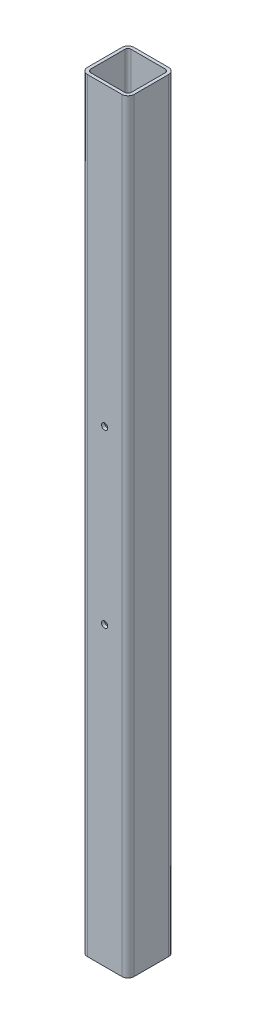
ISO-10303-21;
HEADER;
FILE_DESCRIPTION(('STEP AP214'),'2;1');
FILE_NAME('part.step','',(''),(''),'','','');
FILE_SCHEMA(('AUTOMOTIVE_DESIGN { 1 0 10303 214 1 1 1 1 }'));
ENDSEC;
DATA;
#1=APPLICATION_CONTEXT('core data for automotive mechanical design processes');
#2=APPLICATION_PROTOCOL_DEFINITION('international standard','automotive_design',2000,#1);
#3=PRODUCT_CONTEXT('',#1,'mechanical');
#4=PRODUCT('Part','Part','',(#3));
#5=PRODUCT_RELATED_PRODUCT_CATEGORY('part','',(#4));
#6=PRODUCT_DEFINITION_FORMATION('','',#4);
#7=PRODUCT_DEFINITION_CONTEXT('part definition',#1,'design');
#8=PRODUCT_DEFINITION('design','',#6,#7);
#9=PRODUCT_DEFINITION_SHAPE('','',#8);
#10=(LENGTH_UNIT() NAMED_UNIT(*) SI_UNIT(.MILLI.,.METRE.));
#11=(NAMED_UNIT(*) PLANE_ANGLE_UNIT() SI_UNIT($,.RADIAN.));
#12=(NAMED_UNIT(*) SI_UNIT($,.STERADIAN.) SOLID_ANGLE_UNIT());
#13=UNCERTAINTY_MEASURE_WITH_UNIT(LENGTH_MEASURE(1.E-05),#10,'distance_accuracy_value','');
#14=(GEOMETRIC_REPRESENTATION_CONTEXT(3) GLOBAL_UNCERTAINTY_ASSIGNED_CONTEXT((#13)) GLOBAL_UNIT_ASSIGNED_CONTEXT((#10,
#11,#12)) REPRESENTATION_CONTEXT('',''));
#15=CARTESIAN_POINT('',(0.,0.,0.));
#16=DIRECTION('',(0.,0.,1.));
#17=DIRECTION('',(1.,0.,0.));
#18=AXIS2_PLACEMENT_3D('',#15,#16,#17);
#19=CARTESIAN_POINT('',(-11.,245.,11.));
#20=DIRECTION('',(0.,-1.,0.));
#21=DIRECTION('',(0.,0.,-1.));
#22=AXIS2_PLACEMENT_3D('',#19,#20,#21);
#23=PLANE('',#22);
#24=CARTESIAN_POINT('',(-11.,245.,11.));
#25=DIRECTION('',(0.,1.,0.));
#26=DIRECTION('',(0.,0.,-1.));
#27=AXIS2_PLACEMENT_3D('',#24,#25,#26);
#28=CIRCLE('',#27,4.);
#29=CARTESIAN_POINT('',(-15.,245.,11.));
#30=VERTEX_POINT('',#29);
#31=CARTESIAN_POINT('',(-11.,245.,15.));
#32=VERTEX_POINT('',#31);
#33=EDGE_CURVE('E216',#30,#32,#28,.T.);
#34=ORIENTED_EDGE('',*,*,#33,.T.);
#35=DIRECTION('',(1.,0.,0.));
#36=VECTOR('',#35,1.);
#37=CARTESIAN_POINT('',(-11.,245.,15.));
#38=LINE('',#37,#36);
#39=CARTESIAN_POINT('',(11.,245.,15.));
#40=VERTEX_POINT('',#39);
#41=EDGE_CURVE('E219',#32,#40,#38,.T.);
#42=ORIENTED_EDGE('',*,*,#41,.T.);
#43=CARTESIAN_POINT('',(11.,245.,11.));
#44=DIRECTION('',(0.,1.,0.));
#45=DIRECTION('',(0.,0.,1.));
#46=AXIS2_PLACEMENT_3D('',#43,#44,#45);
#47=CIRCLE('',#46,4.);
#48=CARTESIAN_POINT('',(15.,245.,11.));
#49=VERTEX_POINT('',#48);
#50=EDGE_CURVE('E222',#40,#49,#47,.T.);
#51=ORIENTED_EDGE('',*,*,#50,.T.);
#52=DIRECTION('',(0.,0.,-1.));
#53=VECTOR('',#52,1.);
#54=CARTESIAN_POINT('',(15.,245.,11.));
#55=LINE('',#54,#53);
#56=CARTESIAN_POINT('',(15.,245.,-11.));
#57=VERTEX_POINT('',#56);
#58=EDGE_CURVE('E224',#49,#57,#55,.T.);
#59=ORIENTED_EDGE('',*,*,#58,.T.);
#60=CARTESIAN_POINT('',(11.,245.,-11.));
#61=DIRECTION('',(0.,1.,0.));
#62=DIRECTION('',(0.,0.,-1.));
#63=AXIS2_PLACEMENT_3D('',#60,#61,#62);
#64=CIRCLE('',#63,4.);
#65=CARTESIAN_POINT('',(11.,245.,-15.));
#66=VERTEX_POINT('',#65);
#67=EDGE_CURVE('E226',#57,#66,#64,.T.);
#68=ORIENTED_EDGE('',*,*,#67,.T.);
#69=DIRECTION('',(-1.,0.,0.));
#70=VECTOR('',#69,1.);
#71=CARTESIAN_POINT('',(-11.,245.,-15.));
#72=LINE('',#71,#70);
#73=CARTESIAN_POINT('',(-11.,245.,-15.));
#74=VERTEX_POINT('',#73);
#75=EDGE_CURVE('E228',#66,#74,#72,.T.);
#76=ORIENTED_EDGE('',*,*,#75,.T.);
#77=CARTESIAN_POINT('',(-11.,245.,-11.));
#78=DIRECTION('',(0.,1.,0.));
#79=DIRECTION('',(0.,0.,-1.));
#80=AXIS2_PLACEMENT_3D('',#77,#78,#79);
#81=CIRCLE('',#80,4.);
#82=CARTESIAN_POINT('',(-15.,245.,-11.));
#83=VERTEX_POINT('',#82);
#84=EDGE_CURVE('E230',#74,#83,#81,.T.);
#85=ORIENTED_EDGE('',*,*,#84,.T.);
#86=DIRECTION('',(0.,0.,1.));
#87=VECTOR('',#86,1.);
#88=CARTESIAN_POINT('',(-15.,245.,11.));
#89=LINE('',#88,#87);
#90=EDGE_CURVE('E232',#83,#30,#89,.T.);
#91=ORIENTED_EDGE('',*,*,#90,.T.);
#92=EDGE_LOOP('',(#34,#42,#51,#59,#68,#76,#85,#91));
#93=FACE_BOUND('',#92,.T.);
#94=CARTESIAN_POINT('',(-11.,245.,11.));
#95=DIRECTION('',(0.,1.,0.));
#96=DIRECTION('',(0.,0.,-1.));
#97=AXIS2_PLACEMENT_3D('',#94,#95,#96);
#98=CIRCLE('',#97,2.);
#99=CARTESIAN_POINT('',(-13.,245.,11.));
#100=VERTEX_POINT('',#99);
#101=CARTESIAN_POINT('',(-11.,245.,13.));
#102=VERTEX_POINT('',#101);
#103=EDGE_CURVE('E149',#100,#102,#98,.T.);
#104=ORIENTED_EDGE('',*,*,#103,.F.);
#105=DIRECTION('',(0.,0.,1.));
#106=VECTOR('',#105,1.);
#107=CARTESIAN_POINT('',(-13.,245.,11.));
#108=LINE('',#107,#106);
#109=CARTESIAN_POINT('',(-13.,245.,-11.));
#110=VERTEX_POINT('',#109);
#111=EDGE_CURVE('E183',#110,#100,#108,.T.);
#112=ORIENTED_EDGE('',*,*,#111,.F.);
#113=CARTESIAN_POINT('',(-11.,245.,-11.));
#114=DIRECTION('',(0.,1.,0.));
#115=DIRECTION('',(0.,0.,-1.));
#116=AXIS2_PLACEMENT_3D('',#113,#114,#115);
#117=CIRCLE('',#116,2.);
#118=CARTESIAN_POINT('',(-11.,245.,-13.));
#119=VERTEX_POINT('',#118);
#120=EDGE_CURVE('E181',#119,#110,#117,.T.);
#121=ORIENTED_EDGE('',*,*,#120,.F.);
#122=DIRECTION('',(-1.,0.,0.));
#123=VECTOR('',#122,1.);
#124=CARTESIAN_POINT('',(-11.,245.,-13.));
#125=LINE('',#124,#123);
#126=CARTESIAN_POINT('',(11.,245.,-13.));
#127=VERTEX_POINT('',#126);
#128=EDGE_CURVE('E179',#127,#119,#125,.T.);
#129=ORIENTED_EDGE('',*,*,#128,.F.);
#130=CARTESIAN_POINT('',(11.,245.,-11.));
#131=DIRECTION('',(0.,1.,0.));
#132=DIRECTION('',(0.,0.,-1.));
#133=AXIS2_PLACEMENT_3D('',#130,#131,#132);
#134=CIRCLE('',#133,2.);
#135=CARTESIAN_POINT('',(13.,245.,-11.));
#136=VERTEX_POINT('',#135);
#137=EDGE_CURVE('E177',#136,#127,#134,.T.);
#138=ORIENTED_EDGE('',*,*,#137,.F.);
#139=DIRECTION('',(0.,0.,-1.));
#140=VECTOR('',#139,1.);
#141=CARTESIAN_POINT('',(13.,245.,11.));
#142=LINE('',#141,#140);
#143=CARTESIAN_POINT('',(13.,245.,11.));
#144=VERTEX_POINT('',#143);
#145=EDGE_CURVE('E172',#144,#136,#142,.T.);
#146=ORIENTED_EDGE('',*,*,#145,.F.);
#147=CARTESIAN_POINT('',(11.,245.,11.));
#148=DIRECTION('',(0.,1.,0.));
#149=DIRECTION('',(0.,0.,1.));
#150=AXIS2_PLACEMENT_3D('',#147,#148,#149);
#151=CIRCLE('',#150,2.);
#152=CARTESIAN_POINT('',(11.,245.,13.));
#153=VERTEX_POINT('',#152);
#154=EDGE_CURVE('E170',#153,#144,#151,.T.);
#155=ORIENTED_EDGE('',*,*,#154,.F.);
#156=DIRECTION('',(1.,0.,0.));
#157=VECTOR('',#156,1.);
#158=CARTESIAN_POINT('',(-11.,245.,13.));
#159=LINE('',#158,#157);
#160=EDGE_CURVE('E157',#102,#153,#159,.T.);
#161=ORIENTED_EDGE('',*,*,#160,.F.);
#162=EDGE_LOOP('',(#104,#112,#121,#129,#138,#146,#155,#161));
#163=FACE_BOUND('',#162,.T.);
#164=ADVANCED_FACE('F34',(#93,#163),#23,.F.);
#165=CARTESIAN_POINT('',(-11.,-245.,11.));
#166=DIRECTION('',(0.,-1.,0.));
#167=DIRECTION('',(0.,0.,-1.));
#168=AXIS2_PLACEMENT_3D('',#165,#166,#167);
#169=PLANE('',#168);
#170=CARTESIAN_POINT('',(-11.,-245.,11.));
#171=DIRECTION('',(0.,1.,0.));
#172=DIRECTION('',(0.,0.,-1.));
#173=AXIS2_PLACEMENT_3D('',#170,#171,#172);
#174=CIRCLE('',#173,4.);
#175=CARTESIAN_POINT('',(-15.,-245.,11.));
#176=VERTEX_POINT('',#175);
#177=CARTESIAN_POINT('',(-11.,-245.,15.));
#178=VERTEX_POINT('',#177);
#179=EDGE_CURVE('E165',#176,#178,#174,.T.);
#180=ORIENTED_EDGE('',*,*,#179,.F.);
#181=DIRECTION('',(0.,0.,1.));
#182=VECTOR('',#181,1.);
#183=CARTESIAN_POINT('',(-15.,-245.,11.));
#184=LINE('',#183,#182);
#185=CARTESIAN_POINT('',(-15.,-245.,-11.));
#186=VERTEX_POINT('',#185);
#187=EDGE_CURVE('E220',#186,#176,#184,.T.);
#188=ORIENTED_EDGE('',*,*,#187,.F.);
#189=CARTESIAN_POINT('',(-11.,-245.,-11.));
#190=DIRECTION('',(0.,1.,0.));
#191=DIRECTION('',(0.,0.,-1.));
#192=AXIS2_PLACEMENT_3D('',#189,#190,#191);
#193=CIRCLE('',#192,4.);
#194=CARTESIAN_POINT('',(-11.,-245.,-15.));
#195=VERTEX_POINT('',#194);
#196=EDGE_CURVE('E247',#195,#186,#193,.T.);
#197=ORIENTED_EDGE('',*,*,#196,.F.);
#198=DIRECTION('',(-1.,0.,0.));
#199=VECTOR('',#198,1.);
#200=CARTESIAN_POINT('',(-11.,-245.,-15.));
#201=LINE('',#200,#199);
#202=CARTESIAN_POINT('',(11.,-245.,-15.));
#203=VERTEX_POINT('',#202);
#204=EDGE_CURVE('E245',#203,#195,#201,.T.);
#205=ORIENTED_EDGE('',*,*,#204,.F.);
#206=CARTESIAN_POINT('',(11.,-245.,-11.));
#207=DIRECTION('',(0.,1.,0.));
#208=DIRECTION('',(0.,0.,-1.));
#209=AXIS2_PLACEMENT_3D('',#206,#207,#208);
#210=CIRCLE('',#209,4.);
#211=CARTESIAN_POINT('',(15.,-245.,-11.));
#212=VERTEX_POINT('',#211);
#213=EDGE_CURVE('E243',#212,#203,#210,.T.);
#214=ORIENTED_EDGE('',*,*,#213,.F.);
#215=DIRECTION('',(0.,0.,-1.));
#216=VECTOR('',#215,1.);
#217=CARTESIAN_POINT('',(15.,-245.,11.));
#218=LINE('',#217,#216);
#219=CARTESIAN_POINT('',(15.,-245.,11.));
#220=VERTEX_POINT('',#219);
#221=EDGE_CURVE('E241',#220,#212,#218,.T.);
#222=ORIENTED_EDGE('',*,*,#221,.F.);
#223=CARTESIAN_POINT('',(11.,-245.,11.));
#224=DIRECTION('',(0.,1.,0.));
#225=DIRECTION('',(0.,0.,1.));
#226=AXIS2_PLACEMENT_3D('',#223,#224,#225);
#227=CIRCLE('',#226,4.);
#228=CARTESIAN_POINT('',(11.,-245.,15.));
#229=VERTEX_POINT('',#228);
#230=EDGE_CURVE('E239',#229,#220,#227,.T.);
#231=ORIENTED_EDGE('',*,*,#230,.F.);
#232=DIRECTION('',(1.,0.,0.));
#233=VECTOR('',#232,1.);
#234=CARTESIAN_POINT('',(-11.,-245.,15.));
#235=LINE('',#234,#233);
#236=EDGE_CURVE('E237',#178,#229,#235,.T.);
#237=ORIENTED_EDGE('',*,*,#236,.F.);
#238=EDGE_LOOP('',(#180,#188,#197,#205,#214,#222,#231,#237));
#239=FACE_BOUND('',#238,.T.);
#240=DIRECTION('',(0.,0.,1.));
#241=VECTOR('',#240,1.);
#242=CARTESIAN_POINT('',(-13.,-245.,11.));
#243=LINE('',#242,#241);
#244=CARTESIAN_POINT('',(-13.,-245.,-11.));
#245=VERTEX_POINT('',#244);
#246=CARTESIAN_POINT('',(-13.,-245.,11.));
#247=VERTEX_POINT('',#246);
#248=EDGE_CURVE('E158',#245,#247,#243,.T.);
#249=ORIENTED_EDGE('',*,*,#248,.T.);
#250=CARTESIAN_POINT('',(-11.,-245.,11.));
#251=DIRECTION('',(0.,1.,0.));
#252=DIRECTION('',(0.,0.,-1.));
#253=AXIS2_PLACEMENT_3D('',#250,#251,#252);
#254=CIRCLE('',#253,2.);
#255=CARTESIAN_POINT('',(-11.,-245.,13.));
#256=VERTEX_POINT('',#255);
#257=EDGE_CURVE('E59',#247,#256,#254,.T.);
#258=ORIENTED_EDGE('',*,*,#257,.T.);
#259=DIRECTION('',(1.,0.,0.));
#260=VECTOR('',#259,1.);
#261=CARTESIAN_POINT('',(-11.,-245.,13.));
#262=LINE('',#261,#260);
#263=CARTESIAN_POINT('',(11.,-245.,13.));
#264=VERTEX_POINT('',#263);
#265=EDGE_CURVE('E164',#256,#264,#262,.T.);
#266=ORIENTED_EDGE('',*,*,#265,.T.);
#267=CARTESIAN_POINT('',(11.,-245.,11.));
#268=DIRECTION('',(0.,1.,0.));
#269=DIRECTION('',(0.,0.,1.));
#270=AXIS2_PLACEMENT_3D('',#267,#268,#269);
#271=CIRCLE('',#270,2.);
#272=CARTESIAN_POINT('',(13.,-245.,11.));
#273=VERTEX_POINT('',#272);
#274=EDGE_CURVE('E188',#264,#273,#271,.T.);
#275=ORIENTED_EDGE('',*,*,#274,.T.);
#276=DIRECTION('',(0.,0.,-1.));
#277=VECTOR('',#276,1.);
#278=CARTESIAN_POINT('',(13.,-245.,11.));
#279=LINE('',#278,#277);
#280=CARTESIAN_POINT('',(13.,-245.,-11.));
#281=VERTEX_POINT('',#280);
#282=EDGE_CURVE('E191',#273,#281,#279,.T.);
#283=ORIENTED_EDGE('',*,*,#282,.T.);
#284=CARTESIAN_POINT('',(11.,-245.,-11.));
#285=DIRECTION('',(0.,1.,0.));
#286=DIRECTION('',(0.,0.,-1.));
#287=AXIS2_PLACEMENT_3D('',#284,#285,#286);
#288=CIRCLE('',#287,2.);
#289=CARTESIAN_POINT('',(11.,-245.,-13.));
#290=VERTEX_POINT('',#289);
#291=EDGE_CURVE('E194',#281,#290,#288,.T.);
#292=ORIENTED_EDGE('',*,*,#291,.T.);
#293=DIRECTION('',(-1.,0.,0.));
#294=VECTOR('',#293,1.);
#295=CARTESIAN_POINT('',(-11.,-245.,-13.));
#296=LINE('',#295,#294);
#297=CARTESIAN_POINT('',(-11.,-245.,-13.));
#298=VERTEX_POINT('',#297);
#299=EDGE_CURVE('E197',#290,#298,#296,.T.);
#300=ORIENTED_EDGE('',*,*,#299,.T.);
#301=CARTESIAN_POINT('',(-11.,-245.,-11.));
#302=DIRECTION('',(0.,1.,0.));
#303=DIRECTION('',(0.,0.,-1.));
#304=AXIS2_PLACEMENT_3D('',#301,#302,#303);
#305=CIRCLE('',#304,2.);
#306=EDGE_CURVE('E200',#298,#245,#305,.T.);
#307=ORIENTED_EDGE('',*,*,#306,.T.);
#308=EDGE_LOOP('',(#249,#258,#266,#275,#283,#292,#300,#307));
#309=FACE_BOUND('',#308,.T.);
#310=ADVANCED_FACE('F312',(#239,#309),#169,.T.);
#311=CARTESIAN_POINT('',(-11.,245.,11.));
#312=DIRECTION('',(0.,-1.,0.));
#313=DIRECTION('',(0.,0.,-1.));
#314=AXIS2_PLACEMENT_3D('',#311,#312,#313);
#315=CYLINDRICAL_SURFACE('',#314,4.);
#316=ORIENTED_EDGE('',*,*,#179,.T.);
#317=DIRECTION('',(0.,-1.,0.));
#318=VECTOR('',#317,1.);
#319=CARTESIAN_POINT('',(-11.,245.,15.));
#320=LINE('',#319,#318);
#321=EDGE_CURVE('E11',#32,#178,#320,.T.);
#322=ORIENTED_EDGE('',*,*,#321,.F.);
#323=ORIENTED_EDGE('',*,*,#33,.F.);
#324=DIRECTION('',(0.,-1.,0.));
#325=VECTOR('',#324,1.);
#326=CARTESIAN_POINT('',(-15.,245.,11.));
#327=LINE('',#326,#325);
#328=EDGE_CURVE('E234',#30,#176,#327,.T.);
#329=ORIENTED_EDGE('',*,*,#328,.T.);
#330=EDGE_LOOP('',(#316,#322,#323,#329));
#331=FACE_BOUND('',#330,.T.);
#332=ADVANCED_FACE('F36',(#331),#315,.T.);
#333=CARTESIAN_POINT('',(-11.,245.,15.));
#334=DIRECTION('',(0.,0.,-1.));
#335=DIRECTION('',(-1.,0.,0.));
#336=AXIS2_PLACEMENT_3D('',#333,#334,#335);
#337=PLANE('',#336);
#338=CARTESIAN_POINT('',(0.,55.,15.));
#339=DIRECTION('',(0.,0.,1.));
#340=DIRECTION('',(1.,0.,0.));
#341=AXIS2_PLACEMENT_3D('',#338,#339,#340);
#342=CIRCLE('',#341,2.);
#343=CARTESIAN_POINT('',(1.99999999999999,55.,15.));
#344=VERTEX_POINT('',#343);
#345=EDGE_CURVE('E277',#344,#344,#342,.T.);
#346=ORIENTED_EDGE('',*,*,#345,.F.);
#347=EDGE_LOOP('',(#346));
#348=FACE_BOUND('',#347,.T.);
#349=CARTESIAN_POINT('',(0.,-55.,15.));
#350=DIRECTION('',(0.,0.,1.));
#351=DIRECTION('',(1.,0.,0.));
#352=AXIS2_PLACEMENT_3D('',#349,#350,#351);
#353=CIRCLE('',#352,2.);
#354=CARTESIAN_POINT('',(2.,-55.,15.));
#355=VERTEX_POINT('',#354);
#356=EDGE_CURVE('E285',#355,#355,#353,.T.);
#357=ORIENTED_EDGE('',*,*,#356,.F.);
#358=EDGE_LOOP('',(#357));
#359=FACE_BOUND('',#358,.T.);
#360=ORIENTED_EDGE('',*,*,#236,.T.);
#361=DIRECTION('',(0.,-1.,0.));
#362=VECTOR('',#361,1.);
#363=CARTESIAN_POINT('',(11.,245.,15.));
#364=LINE('',#363,#362);
#365=EDGE_CURVE('E43',#40,#229,#364,.T.);
#366=ORIENTED_EDGE('',*,*,#365,.F.);
#367=ORIENTED_EDGE('',*,*,#41,.F.);
#368=ORIENTED_EDGE('',*,*,#321,.T.);
#369=EDGE_LOOP('',(#360,#366,#367,#368));
#370=FACE_BOUND('',#369,.T.);
#371=ADVANCED_FACE('F362',(#348,#359,#370),#337,.F.);
#372=CARTESIAN_POINT('',(11.,245.,11.));
#373=DIRECTION('',(0.,-1.,0.));
#374=DIRECTION('',(0.,0.,-1.));
#375=AXIS2_PLACEMENT_3D('',#372,#373,#374);
#376=CYLINDRICAL_SURFACE('',#375,4.);
#377=ORIENTED_EDGE('',*,*,#230,.T.);
#378=DIRECTION('',(0.,-1.,0.));
#379=VECTOR('',#378,1.);
#380=CARTESIAN_POINT('',(15.,245.,11.));
#381=LINE('',#380,#379);
#382=EDGE_CURVE('E264',#49,#220,#381,.T.);
#383=ORIENTED_EDGE('',*,*,#382,.F.);
#384=ORIENTED_EDGE('',*,*,#50,.F.);
#385=ORIENTED_EDGE('',*,*,#365,.T.);
#386=EDGE_LOOP('',(#377,#383,#384,#385));
#387=FACE_BOUND('',#386,.T.);
#388=ADVANCED_FACE('F359',(#387),#376,.T.);
#389=CARTESIAN_POINT('',(15.,245.,11.));
#390=DIRECTION('',(-1.,0.,0.));
#391=DIRECTION('',(0.,0.,1.));
#392=AXIS2_PLACEMENT_3D('',#389,#390,#391);
#393=PLANE('',#392);
#394=ORIENTED_EDGE('',*,*,#221,.T.);
#395=DIRECTION('',(0.,-1.,0.));
#396=VECTOR('',#395,1.);
#397=CARTESIAN_POINT('',(15.,245.,-11.));
#398=LINE('',#397,#396);
#399=EDGE_CURVE('E261',#57,#212,#398,.T.);
#400=ORIENTED_EDGE('',*,*,#399,.F.);
#401=ORIENTED_EDGE('',*,*,#58,.F.);
#402=ORIENTED_EDGE('',*,*,#382,.T.);
#403=EDGE_LOOP('',(#394,#400,#401,#402));
#404=FACE_BOUND('',#403,.T.);
#405=ADVANCED_FACE('F355',(#404),#393,.F.);
#406=CARTESIAN_POINT('',(11.,245.,-11.));
#407=DIRECTION('',(0.,-1.,0.));
#408=DIRECTION('',(0.,0.,-1.));
#409=AXIS2_PLACEMENT_3D('',#406,#407,#408);
#410=CYLINDRICAL_SURFACE('',#409,4.);
#411=ORIENTED_EDGE('',*,*,#213,.T.);
#412=DIRECTION('',(0.,-1.,0.));
#413=VECTOR('',#412,1.);
#414=CARTESIAN_POINT('',(11.,245.,-15.));
#415=LINE('',#414,#413);
#416=EDGE_CURVE('E258',#66,#203,#415,.T.);
#417=ORIENTED_EDGE('',*,*,#416,.F.);
#418=ORIENTED_EDGE('',*,*,#67,.F.);
#419=ORIENTED_EDGE('',*,*,#399,.T.);
#420=EDGE_LOOP('',(#411,#417,#418,#419));
#421=FACE_BOUND('',#420,.T.);
#422=ADVANCED_FACE('F352',(#421),#410,.T.);
#423=CARTESIAN_POINT('',(-11.,245.,-15.));
#424=DIRECTION('',(0.,0.,1.));
#425=DIRECTION('',(1.,0.,0.));
#426=AXIS2_PLACEMENT_3D('',#423,#424,#425);
#427=PLANE('',#426);
#428=CARTESIAN_POINT('',(0.,55.,-15.));
#429=DIRECTION('',(0.,0.,1.));
#430=DIRECTION('',(1.,0.,0.));
#431=AXIS2_PLACEMENT_3D('',#428,#429,#430);
#432=CIRCLE('',#431,2.);
#433=CARTESIAN_POINT('',(1.99999999999999,55.,-15.));
#434=VERTEX_POINT('',#433);
#435=EDGE_CURVE('E271',#434,#434,#432,.T.);
#436=ORIENTED_EDGE('',*,*,#435,.T.);
#437=EDGE_LOOP('',(#436));
#438=FACE_BOUND('',#437,.T.);
#439=CARTESIAN_POINT('',(0.,-55.,-15.));
#440=DIRECTION('',(0.,0.,1.));
#441=DIRECTION('',(1.,0.,0.));
#442=AXIS2_PLACEMENT_3D('',#439,#440,#441);
#443=CIRCLE('',#442,2.);
#444=CARTESIAN_POINT('',(2.,-55.,-15.));
#445=VERTEX_POINT('',#444);
#446=EDGE_CURVE('E282',#445,#445,#443,.T.);
#447=ORIENTED_EDGE('',*,*,#446,.T.);
#448=EDGE_LOOP('',(#447));
#449=FACE_BOUND('',#448,.T.);
#450=ORIENTED_EDGE('',*,*,#204,.T.);
#451=DIRECTION('',(0.,-1.,0.));
#452=VECTOR('',#451,1.);
#453=CARTESIAN_POINT('',(-11.,245.,-15.));
#454=LINE('',#453,#452);
#455=EDGE_CURVE('E255',#74,#195,#454,.T.);
#456=ORIENTED_EDGE('',*,*,#455,.F.);
#457=ORIENTED_EDGE('',*,*,#75,.F.);
#458=ORIENTED_EDGE('',*,*,#416,.T.);
#459=EDGE_LOOP('',(#450,#456,#457,#458));
#460=FACE_BOUND('',#459,.T.);
#461=ADVANCED_FACE('F348',(#438,#449,#460),#427,.F.);
#462=CARTESIAN_POINT('',(-11.,245.,-11.));
#463=DIRECTION('',(0.,-1.,0.));
#464=DIRECTION('',(0.,0.,-1.));
#465=AXIS2_PLACEMENT_3D('',#462,#463,#464);
#466=CYLINDRICAL_SURFACE('',#465,4.);
#467=ORIENTED_EDGE('',*,*,#196,.T.);
#468=DIRECTION('',(0.,-1.,0.));
#469=VECTOR('',#468,1.);
#470=CARTESIAN_POINT('',(-15.,245.,-11.));
#471=LINE('',#470,#469);
#472=EDGE_CURVE('E252',#83,#186,#471,.T.);
#473=ORIENTED_EDGE('',*,*,#472,.F.);
#474=ORIENTED_EDGE('',*,*,#84,.F.);
#475=ORIENTED_EDGE('',*,*,#455,.T.);
#476=EDGE_LOOP('',(#467,#473,#474,#475));
#477=FACE_BOUND('',#476,.T.);
#478=ADVANCED_FACE('F344',(#477),#466,.T.);
#479=CARTESIAN_POINT('',(-15.,245.,11.));
#480=DIRECTION('',(1.,0.,0.));
#481=DIRECTION('',(0.,0.,-1.));
#482=AXIS2_PLACEMENT_3D('',#479,#480,#481);
#483=PLANE('',#482);
#484=ORIENTED_EDGE('',*,*,#187,.T.);
#485=ORIENTED_EDGE('',*,*,#328,.F.);
#486=ORIENTED_EDGE('',*,*,#90,.F.);
#487=ORIENTED_EDGE('',*,*,#472,.T.);
#488=EDGE_LOOP('',(#484,#485,#486,#487));
#489=FACE_BOUND('',#488,.T.);
#490=ADVANCED_FACE('F341',(#489),#483,.F.);
#491=CARTESIAN_POINT('',(-11.,245.,11.));
#492=DIRECTION('',(0.,-1.,0.));
#493=DIRECTION('',(0.,0.,-1.));
#494=AXIS2_PLACEMENT_3D('',#491,#492,#493);
#495=CYLINDRICAL_SURFACE('',#494,2.);
#496=ORIENTED_EDGE('',*,*,#257,.F.);
#497=DIRECTION('',(0.,-1.,0.));
#498=VECTOR('',#497,1.);
#499=CARTESIAN_POINT('',(-13.,245.,11.));
#500=LINE('',#499,#498);
#501=EDGE_CURVE('E153',#100,#247,#500,.T.);
#502=ORIENTED_EDGE('',*,*,#501,.F.);
#503=ORIENTED_EDGE('',*,*,#103,.T.);
#504=DIRECTION('',(0.,-1.,0.));
#505=VECTOR('',#504,1.);
#506=CARTESIAN_POINT('',(-11.,245.,13.));
#507=LINE('',#506,#505);
#508=EDGE_CURVE('E152',#102,#256,#507,.T.);
#509=ORIENTED_EDGE('',*,*,#508,.T.);
#510=EDGE_LOOP('',(#496,#502,#503,#509));
#511=FACE_BOUND('',#510,.T.);
#512=ADVANCED_FACE('F151',(#511),#495,.F.);
#513=CARTESIAN_POINT('',(-11.,245.,13.));
#514=DIRECTION('',(0.,0.,-1.));
#515=DIRECTION('',(-1.,0.,0.));
#516=AXIS2_PLACEMENT_3D('',#513,#514,#515);
#517=PLANE('',#516);
#518=CARTESIAN_POINT('',(0.,55.,13.));
#519=DIRECTION('',(0.,0.,-1.));
#520=DIRECTION('',(-1.,0.,0.));
#521=AXIS2_PLACEMENT_3D('',#518,#519,#520);
#522=CIRCLE('',#521,2.);
#523=CARTESIAN_POINT('',(1.99999999999999,55.,13.));
#524=VERTEX_POINT('',#523);
#525=EDGE_CURVE('E186',#524,#524,#522,.T.);
#526=ORIENTED_EDGE('',*,*,#525,.F.);
#527=EDGE_LOOP('',(#526));
#528=FACE_BOUND('',#527,.T.);
#529=CARTESIAN_POINT('',(0.,-55.,13.));
#530=DIRECTION('',(0.,0.,-1.));
#531=DIRECTION('',(-1.,0.,0.));
#532=AXIS2_PLACEMENT_3D('',#529,#530,#531);
#533=CIRCLE('',#532,2.);
#534=CARTESIAN_POINT('',(2.,-55.,13.));
#535=VERTEX_POINT('',#534);
#536=EDGE_CURVE('E270',#535,#535,#533,.T.);
#537=ORIENTED_EDGE('',*,*,#536,.F.);
#538=EDGE_LOOP('',(#537));
#539=FACE_BOUND('',#538,.T.);
#540=ORIENTED_EDGE('',*,*,#265,.F.);
#541=ORIENTED_EDGE('',*,*,#508,.F.);
#542=ORIENTED_EDGE('',*,*,#160,.T.);
#543=DIRECTION('',(0.,-1.,0.));
#544=VECTOR('',#543,1.);
#545=CARTESIAN_POINT('',(11.,245.,13.));
#546=LINE('',#545,#544);
#547=EDGE_CURVE('E166',#153,#264,#546,.T.);
#548=ORIENTED_EDGE('',*,*,#547,.T.);
#549=EDGE_LOOP('',(#540,#541,#542,#548));
#550=FACE_BOUND('',#549,.T.);
#551=ADVANCED_FACE('F161',(#528,#539,#550),#517,.T.);
#552=CARTESIAN_POINT('',(11.,245.,11.));
#553=DIRECTION('',(0.,-1.,0.));
#554=DIRECTION('',(0.,0.,-1.));
#555=AXIS2_PLACEMENT_3D('',#552,#553,#554);
#556=CYLINDRICAL_SURFACE('',#555,2.);
#557=ORIENTED_EDGE('',*,*,#274,.F.);
#558=ORIENTED_EDGE('',*,*,#547,.F.);
#559=ORIENTED_EDGE('',*,*,#154,.T.);
#560=DIRECTION('',(0.,-1.,0.));
#561=VECTOR('',#560,1.);
#562=CARTESIAN_POINT('',(13.,245.,11.));
#563=LINE('',#562,#561);
#564=EDGE_CURVE('E213',#144,#273,#563,.T.);
#565=ORIENTED_EDGE('',*,*,#564,.T.);
#566=EDGE_LOOP('',(#557,#558,#559,#565));
#567=FACE_BOUND('',#566,.T.);
#568=ADVANCED_FACE('F409',(#567),#556,.F.);
#569=CARTESIAN_POINT('',(13.,245.,11.));
#570=DIRECTION('',(-1.,0.,0.));
#571=DIRECTION('',(0.,0.,1.));
#572=AXIS2_PLACEMENT_3D('',#569,#570,#571);
#573=PLANE('',#572);
#574=ORIENTED_EDGE('',*,*,#282,.F.);
#575=ORIENTED_EDGE('',*,*,#564,.F.);
#576=ORIENTED_EDGE('',*,*,#145,.T.);
#577=DIRECTION('',(0.,-1.,0.));
#578=VECTOR('',#577,1.);
#579=CARTESIAN_POINT('',(13.,245.,-11.));
#580=LINE('',#579,#578);
#581=EDGE_CURVE('E211',#136,#281,#580,.T.);
#582=ORIENTED_EDGE('',*,*,#581,.T.);
#583=EDGE_LOOP('',(#574,#575,#576,#582));
#584=FACE_BOUND('',#583,.T.);
#585=ADVANCED_FACE('F415',(#584),#573,.T.);
#586=CARTESIAN_POINT('',(11.,245.,-11.));
#587=DIRECTION('',(0.,-1.,0.));
#588=DIRECTION('',(0.,0.,-1.));
#589=AXIS2_PLACEMENT_3D('',#586,#587,#588);
#590=CYLINDRICAL_SURFACE('',#589,2.);
#591=ORIENTED_EDGE('',*,*,#291,.F.);
#592=ORIENTED_EDGE('',*,*,#581,.F.);
#593=ORIENTED_EDGE('',*,*,#137,.T.);
#594=DIRECTION('',(0.,-1.,0.));
#595=VECTOR('',#594,1.);
#596=CARTESIAN_POINT('',(11.,245.,-13.));
#597=LINE('',#596,#595);
#598=EDGE_CURVE('E209',#127,#290,#597,.T.);
#599=ORIENTED_EDGE('',*,*,#598,.T.);
#600=EDGE_LOOP('',(#591,#592,#593,#599));
#601=FACE_BOUND('',#600,.T.);
#602=ADVANCED_FACE('F302',(#601),#590,.F.);
#603=CARTESIAN_POINT('',(-11.,245.,-13.));
#604=DIRECTION('',(0.,0.,1.));
#605=DIRECTION('',(1.,0.,0.));
#606=AXIS2_PLACEMENT_3D('',#603,#604,#605);
#607=PLANE('',#606);
#608=CARTESIAN_POINT('',(0.,55.,-13.));
#609=DIRECTION('',(0.,0.,1.));
#610=DIRECTION('',(1.,0.,0.));
#611=AXIS2_PLACEMENT_3D('',#608,#609,#610);
#612=CIRCLE('',#611,2.);
#613=CARTESIAN_POINT('',(1.99999999999999,55.,-13.));
#614=VERTEX_POINT('',#613);
#615=EDGE_CURVE('E38',#614,#614,#612,.T.);
#616=ORIENTED_EDGE('',*,*,#615,.F.);
#617=EDGE_LOOP('',(#616));
#618=FACE_BOUND('',#617,.T.);
#619=CARTESIAN_POINT('',(0.,-55.,-13.));
#620=DIRECTION('',(0.,0.,1.));
#621=DIRECTION('',(1.,0.,0.));
#622=AXIS2_PLACEMENT_3D('',#619,#620,#621);
#623=CIRCLE('',#622,2.);
#624=CARTESIAN_POINT('',(2.,-55.,-13.));
#625=VERTEX_POINT('',#624);
#626=EDGE_CURVE('E268',#625,#625,#623,.T.);
#627=ORIENTED_EDGE('',*,*,#626,.F.);
#628=EDGE_LOOP('',(#627));
#629=FACE_BOUND('',#628,.T.);
#630=ORIENTED_EDGE('',*,*,#299,.F.);
#631=ORIENTED_EDGE('',*,*,#598,.F.);
#632=ORIENTED_EDGE('',*,*,#128,.T.);
#633=DIRECTION('',(0.,-1.,0.));
#634=VECTOR('',#633,1.);
#635=CARTESIAN_POINT('',(-11.,245.,-13.));
#636=LINE('',#635,#634);
#637=EDGE_CURVE('E207',#119,#298,#636,.T.);
#638=ORIENTED_EDGE('',*,*,#637,.T.);
#639=EDGE_LOOP('',(#630,#631,#632,#638));
#640=FACE_BOUND('',#639,.T.);
#641=ADVANCED_FACE('F298',(#618,#629,#640),#607,.T.);
#642=CARTESIAN_POINT('',(-11.,245.,-11.));
#643=DIRECTION('',(0.,-1.,0.));
#644=DIRECTION('',(0.,0.,-1.));
#645=AXIS2_PLACEMENT_3D('',#642,#643,#644);
#646=CYLINDRICAL_SURFACE('',#645,2.);
#647=ORIENTED_EDGE('',*,*,#306,.F.);
#648=ORIENTED_EDGE('',*,*,#637,.F.);
#649=ORIENTED_EDGE('',*,*,#120,.T.);
#650=DIRECTION('',(0.,-1.,0.));
#651=VECTOR('',#650,1.);
#652=CARTESIAN_POINT('',(-13.,245.,-11.));
#653=LINE('',#652,#651);
#654=EDGE_CURVE('E51',#110,#245,#653,.T.);
#655=ORIENTED_EDGE('',*,*,#654,.T.);
#656=EDGE_LOOP('',(#647,#648,#649,#655));
#657=FACE_BOUND('',#656,.T.);
#658=ADVANCED_FACE('F301',(#657),#646,.F.);
#659=CARTESIAN_POINT('',(-13.,245.,11.));
#660=DIRECTION('',(1.,0.,0.));
#661=DIRECTION('',(0.,0.,-1.));
#662=AXIS2_PLACEMENT_3D('',#659,#660,#661);
#663=PLANE('',#662);
#664=ORIENTED_EDGE('',*,*,#248,.F.);
#665=ORIENTED_EDGE('',*,*,#654,.F.);
#666=ORIENTED_EDGE('',*,*,#111,.T.);
#667=ORIENTED_EDGE('',*,*,#501,.T.);
#668=EDGE_LOOP('',(#664,#665,#666,#667));
#669=FACE_BOUND('',#668,.T.);
#670=ADVANCED_FACE('F319',(#669),#663,.T.);
#671=CARTESIAN_POINT('',(0.,-55.,-15.));
#672=DIRECTION('',(0.,0.,1.));
#673=DIRECTION('',(1.,0.,0.));
#674=AXIS2_PLACEMENT_3D('',#671,#672,#673);
#675=CYLINDRICAL_SURFACE('',#674,2.);
#676=CARTESIAN_POINT('',(2.,-55.,-13.));
#677=CARTESIAN_POINT('',(2.,-55.,-13.0208333333333));
#678=CARTESIAN_POINT('',(2.,-55.,-13.0416666666667));
#679=CARTESIAN_POINT('',(2.,-55.,-13.0833333333333));
#680=CARTESIAN_POINT('',(2.,-55.,-13.1041666666667));
#681=CARTESIAN_POINT('',(2.,-55.,-13.1458333333333));
#682=CARTESIAN_POINT('',(2.,-55.,-13.1666666666667));
#683=CARTESIAN_POINT('',(2.,-55.,-13.2083333333333));
#684=CARTESIAN_POINT('',(2.,-55.,-13.2291666666667));
#685=CARTESIAN_POINT('',(2.,-55.,-13.2708333333333));
#686=CARTESIAN_POINT('',(2.,-55.,-13.2916666666667));
#687=CARTESIAN_POINT('',(2.,-55.,-13.3333333333333));
#688=CARTESIAN_POINT('',(2.,-55.,-13.3541666666667));
#689=CARTESIAN_POINT('',(2.,-55.,-13.3958333333333));
#690=CARTESIAN_POINT('',(2.,-55.,-13.4166666666667));
#691=CARTESIAN_POINT('',(2.,-55.,-13.4583333333333));
#692=CARTESIAN_POINT('',(2.,-55.,-13.4791666666667));
#693=CARTESIAN_POINT('',(2.,-55.,-13.5208333333333));
#694=CARTESIAN_POINT('',(2.,-55.,-13.5416666666667));
#695=CARTESIAN_POINT('',(2.,-55.,-13.5833333333333));
#696=CARTESIAN_POINT('',(2.,-55.,-13.6041666666667));
#697=CARTESIAN_POINT('',(2.,-55.,-13.6458333333333));
#698=CARTESIAN_POINT('',(2.,-55.,-13.6666666666667));
#699=CARTESIAN_POINT('',(2.,-55.,-13.7083333333333));
#700=CARTESIAN_POINT('',(2.,-55.,-13.7291666666667));
#701=CARTESIAN_POINT('',(2.,-55.,-13.7708333333333));
#702=CARTESIAN_POINT('',(2.,-55.,-13.7916666666667));
#703=CARTESIAN_POINT('',(2.,-55.,-13.8333333333333));
#704=CARTESIAN_POINT('',(2.,-55.,-13.8541666666667));
#705=CARTESIAN_POINT('',(2.,-55.,-13.8958333333333));
#706=CARTESIAN_POINT('',(2.,-55.,-13.9166666666667));
#707=CARTESIAN_POINT('',(2.,-55.,-13.9583333333333));
#708=CARTESIAN_POINT('',(2.,-55.,-13.9791666666667));
#709=CARTESIAN_POINT('',(2.,-55.,-14.0208333333333));
#710=CARTESIAN_POINT('',(2.,-55.,-14.0416666666667));
#711=CARTESIAN_POINT('',(2.,-55.,-14.0833333333333));
#712=CARTESIAN_POINT('',(2.,-55.,-14.1041666666667));
#713=CARTESIAN_POINT('',(2.,-55.,-14.1458333333333));
#714=CARTESIAN_POINT('',(2.,-55.,-14.1666666666667));
#715=CARTESIAN_POINT('',(2.,-55.,-14.2083333333333));
#716=CARTESIAN_POINT('',(2.,-55.,-14.2291666666667));
#717=CARTESIAN_POINT('',(2.,-55.,-14.2708333333333));
#718=CARTESIAN_POINT('',(2.,-55.,-14.2916666666667));
#719=CARTESIAN_POINT('',(2.,-55.,-14.3333333333333));
#720=CARTESIAN_POINT('',(2.,-55.,-14.3541666666667));
#721=CARTESIAN_POINT('',(2.,-55.,-14.3958333333333));
#722=CARTESIAN_POINT('',(2.,-55.,-14.4166666666667));
#723=CARTESIAN_POINT('',(2.,-55.,-14.4583333333333));
#724=CARTESIAN_POINT('',(2.,-55.,-14.4791666666667));
#725=CARTESIAN_POINT('',(2.,-55.,-14.5208333333333));
#726=CARTESIAN_POINT('',(2.,-55.,-14.5416666666667));
#727=CARTESIAN_POINT('',(2.,-55.,-14.5833333333333));
#728=CARTESIAN_POINT('',(2.,-55.,-14.6041666666667));
#729=CARTESIAN_POINT('',(2.,-55.,-14.6458333333333));
#730=CARTESIAN_POINT('',(2.,-55.,-14.6666666666667));
#731=CARTESIAN_POINT('',(2.,-55.,-14.7083333333333));
#732=CARTESIAN_POINT('',(2.,-55.,-14.7291666666667));
#733=CARTESIAN_POINT('',(2.,-55.,-14.7708333333333));
#734=CARTESIAN_POINT('',(2.,-55.,-14.7916666666667));
#735=CARTESIAN_POINT('',(2.,-55.,-14.8333333333333));
#736=CARTESIAN_POINT('',(2.,-55.,-14.8541666666667));
#737=CARTESIAN_POINT('',(2.,-55.,-14.8958333333333));
#738=CARTESIAN_POINT('',(2.,-55.,-14.9166666666667));
#739=CARTESIAN_POINT('',(2.,-55.,-14.9583333333333));
#740=CARTESIAN_POINT('',(2.,-55.,-14.9791666666667));
#741=CARTESIAN_POINT('',(2.,-55.,-15.));
#742=B_SPLINE_CURVE_WITH_KNOTS('',3,(#676,#677,#678,#679,#680,#681,#682,#683,#684,#685,#686,
#687,#688,#689,#690,#691,#692,#693,#694,#695,#696,#697,#698,#699,#700,#701,#702,#703,#704,#705,
#706,#707,#708,#709,#710,#711,#712,#713,#714,#715,#716,#717,#718,#719,#720,#721,#722,#723,#724,
#725,#726,#727,#728,#729,#730,#731,#732,#733,#734,#735,#736,#737,#738,#739,#740,#741),
.UNSPECIFIED.,.F.,.F.,(4,2,2,2,2,2,2,2,2,2,2,2,2,2,2,2,2,2,2,2,2,2,2,2,2,2,2,2,2,2,2,2,4),(0.,
0.0625000000000001,0.125,0.1875,0.25,0.3125,0.375,0.4375,0.5,0.5625,0.625000000000001,
0.687500000000001,0.750000000000001,0.812500000000001,0.875000000000001,0.937500000000001,1.,
1.0625,1.125,1.1875,1.25,1.3125,1.375,1.4375,1.5,1.5625,1.625,1.6875,1.75,1.8125,1.875,1.9375,
2.),.UNSPECIFIED.);
#743=EDGE_CURVE('BSEAM321',#625,#445,#742,.T.);
#744=ORIENTED_EDGE('',*,*,#626,.T.);
#745=ORIENTED_EDGE('',*,*,#446,.F.);
#746=ORIENTED_EDGE('',*,*,#743,.T.);
#747=ORIENTED_EDGE('',*,*,#743,.F.);
#748=EDGE_LOOP('',(#744,#746,#745,#747));
#749=FACE_BOUND('',#748,.T.);
#750=ADVANCED_FACE('F321',(#749),#675,.F.);
#751=CARTESIAN_POINT('',(0.,55.,-15.));
#752=DIRECTION('',(0.,0.,1.));
#753=DIRECTION('',(1.,0.,0.));
#754=AXIS2_PLACEMENT_3D('',#751,#752,#753);
#755=CYLINDRICAL_SURFACE('',#754,2.);
#756=CARTESIAN_POINT('',(1.99999999999999,55.,-13.));
#757=CARTESIAN_POINT('',(1.99999999999999,55.,-13.0208333333333));
#758=CARTESIAN_POINT('',(1.99999999999999,55.,-13.0416666666667));
#759=CARTESIAN_POINT('',(1.99999999999999,55.,-13.0833333333333));
#760=CARTESIAN_POINT('',(1.99999999999999,55.,-13.1041666666667));
#761=CARTESIAN_POINT('',(1.99999999999999,55.,-13.1458333333333));
#762=CARTESIAN_POINT('',(1.99999999999999,55.,-13.1666666666667));
#763=CARTESIAN_POINT('',(1.99999999999999,55.,-13.2083333333333));
#764=CARTESIAN_POINT('',(1.99999999999999,55.,-13.2291666666667));
#765=CARTESIAN_POINT('',(1.99999999999999,55.,-13.2708333333333));
#766=CARTESIAN_POINT('',(1.99999999999999,55.,-13.2916666666667));
#767=CARTESIAN_POINT('',(1.99999999999999,55.,-13.3333333333333));
#768=CARTESIAN_POINT('',(1.99999999999999,55.,-13.3541666666667));
#769=CARTESIAN_POINT('',(1.99999999999999,55.,-13.3958333333333));
#770=CARTESIAN_POINT('',(1.99999999999999,55.,-13.4166666666667));
#771=CARTESIAN_POINT('',(1.99999999999999,55.,-13.4583333333333));
#772=CARTESIAN_POINT('',(1.99999999999999,55.,-13.4791666666667));
#773=CARTESIAN_POINT('',(1.99999999999999,55.,-13.5208333333333));
#774=CARTESIAN_POINT('',(1.99999999999999,55.,-13.5416666666667));
#775=CARTESIAN_POINT('',(1.99999999999999,55.,-13.5833333333333));
#776=CARTESIAN_POINT('',(1.99999999999999,55.,-13.6041666666667));
#777=CARTESIAN_POINT('',(1.99999999999999,55.,-13.6458333333333));
#778=CARTESIAN_POINT('',(1.99999999999999,55.,-13.6666666666667));
#779=CARTESIAN_POINT('',(1.99999999999999,55.,-13.7083333333333));
#780=CARTESIAN_POINT('',(1.99999999999999,55.,-13.7291666666667));
#781=CARTESIAN_POINT('',(1.99999999999999,55.,-13.7708333333333));
#782=CARTESIAN_POINT('',(1.99999999999999,55.,-13.7916666666667));
#783=CARTESIAN_POINT('',(1.99999999999999,55.,-13.8333333333333));
#784=CARTESIAN_POINT('',(1.99999999999999,55.,-13.8541666666667));
#785=CARTESIAN_POINT('',(1.99999999999999,55.,-13.8958333333333));
#786=CARTESIAN_POINT('',(1.99999999999999,55.,-13.9166666666667));
#787=CARTESIAN_POINT('',(1.99999999999999,55.,-13.9583333333333));
#788=CARTESIAN_POINT('',(1.99999999999999,55.,-13.9791666666667));
#789=CARTESIAN_POINT('',(1.99999999999999,55.,-14.0208333333333));
#790=CARTESIAN_POINT('',(1.99999999999999,55.,-14.0416666666667));
#791=CARTESIAN_POINT('',(1.99999999999999,55.,-14.0833333333333));
#792=CARTESIAN_POINT('',(1.99999999999999,55.,-14.1041666666667));
#793=CARTESIAN_POINT('',(1.99999999999999,55.,-14.1458333333333));
#794=CARTESIAN_POINT('',(1.99999999999999,55.,-14.1666666666667));
#795=CARTESIAN_POINT('',(1.99999999999999,55.,-14.2083333333333));
#796=CARTESIAN_POINT('',(1.99999999999999,55.,-14.2291666666667));
#797=CARTESIAN_POINT('',(1.99999999999999,55.,-14.2708333333333));
#798=CARTESIAN_POINT('',(1.99999999999999,55.,-14.2916666666667));
#799=CARTESIAN_POINT('',(1.99999999999999,55.,-14.3333333333333));
#800=CARTESIAN_POINT('',(1.99999999999999,55.,-14.3541666666667));
#801=CARTESIAN_POINT('',(1.99999999999999,55.,-14.3958333333333));
#802=CARTESIAN_POINT('',(1.99999999999999,55.,-14.4166666666667));
#803=CARTESIAN_POINT('',(1.99999999999999,55.,-14.4583333333333));
#804=CARTESIAN_POINT('',(1.99999999999999,55.,-14.4791666666667));
#805=CARTESIAN_POINT('',(1.99999999999999,55.,-14.5208333333333));
#806=CARTESIAN_POINT('',(1.99999999999999,55.,-14.5416666666667));
#807=CARTESIAN_POINT('',(1.99999999999999,55.,-14.5833333333333));
#808=CARTESIAN_POINT('',(1.99999999999999,55.,-14.6041666666667));
#809=CARTESIAN_POINT('',(1.99999999999999,55.,-14.6458333333333));
#810=CARTESIAN_POINT('',(1.99999999999999,55.,-14.6666666666667));
#811=CARTESIAN_POINT('',(1.99999999999999,55.,-14.7083333333333));
#812=CARTESIAN_POINT('',(1.99999999999999,55.,-14.7291666666667));
#813=CARTESIAN_POINT('',(1.99999999999999,55.,-14.7708333333333));
#814=CARTESIAN_POINT('',(1.99999999999999,55.,-14.7916666666667));
#815=CARTESIAN_POINT('',(1.99999999999999,55.,-14.8333333333333));
#816=CARTESIAN_POINT('',(1.99999999999999,55.,-14.8541666666667));
#817=CARTESIAN_POINT('',(1.99999999999999,55.,-14.8958333333333));
#818=CARTESIAN_POINT('',(1.99999999999999,55.,-14.9166666666667));
#819=CARTESIAN_POINT('',(1.99999999999999,55.,-14.9583333333333));
#820=CARTESIAN_POINT('',(1.99999999999999,55.,-14.9791666666667));
#821=CARTESIAN_POINT('',(1.99999999999999,55.,-15.));
#822=B_SPLINE_CURVE_WITH_KNOTS('',3,(#756,#757,#758,#759,#760,#761,#762,#763,#764,#765,#766,
#767,#768,#769,#770,#771,#772,#773,#774,#775,#776,#777,#778,#779,#780,#781,#782,#783,#784,#785,
#786,#787,#788,#789,#790,#791,#792,#793,#794,#795,#796,#797,#798,#799,#800,#801,#802,#803,#804,
#805,#806,#807,#808,#809,#810,#811,#812,#813,#814,#815,#816,#817,#818,#819,#820,#821),
.UNSPECIFIED.,.F.,.F.,(4,2,2,2,2,2,2,2,2,2,2,2,2,2,2,2,2,2,2,2,2,2,2,2,2,2,2,2,2,2,2,2,4),(0.,
0.0625000000000001,0.125,0.1875,0.25,0.3125,0.375,0.4375,0.5,0.5625,0.625000000000001,
0.687500000000001,0.750000000000001,0.812500000000001,0.875000000000001,0.937500000000001,1.,
1.0625,1.125,1.1875,1.25,1.3125,1.375,1.4375,1.5,1.5625,1.625,1.6875,1.75,1.8125,1.875,1.9375,
2.),.UNSPECIFIED.);
#823=EDGE_CURVE('BSEAM295',#614,#434,#822,.T.);
#824=ORIENTED_EDGE('',*,*,#615,.T.);
#825=ORIENTED_EDGE('',*,*,#435,.F.);
#826=ORIENTED_EDGE('',*,*,#823,.T.);
#827=ORIENTED_EDGE('',*,*,#823,.F.);
#828=EDGE_LOOP('',(#824,#826,#825,#827));
#829=FACE_BOUND('',#828,.T.);
#830=ADVANCED_FACE('F295',(#829),#755,.F.);
#831=CARTESIAN_POINT('',(2.,-55.,13.));
#832=CARTESIAN_POINT('',(2.,-55.,13.0208333333333));
#833=CARTESIAN_POINT('',(2.,-55.,13.0416666666667));
#834=CARTESIAN_POINT('',(2.,-55.,13.0833333333333));
#835=CARTESIAN_POINT('',(2.,-55.,13.1041666666667));
#836=CARTESIAN_POINT('',(2.,-55.,13.1458333333333));
#837=CARTESIAN_POINT('',(2.,-55.,13.1666666666667));
#838=CARTESIAN_POINT('',(2.,-55.,13.2083333333333));
#839=CARTESIAN_POINT('',(2.,-55.,13.2291666666667));
#840=CARTESIAN_POINT('',(2.,-55.,13.2708333333333));
#841=CARTESIAN_POINT('',(2.,-55.,13.2916666666667));
#842=CARTESIAN_POINT('',(2.,-55.,13.3333333333333));
#843=CARTESIAN_POINT('',(2.,-55.,13.3541666666667));
#844=CARTESIAN_POINT('',(2.,-55.,13.3958333333333));
#845=CARTESIAN_POINT('',(2.,-55.,13.4166666666667));
#846=CARTESIAN_POINT('',(2.,-55.,13.4583333333333));
#847=CARTESIAN_POINT('',(2.,-55.,13.4791666666667));
#848=CARTESIAN_POINT('',(2.,-55.,13.5208333333333));
#849=CARTESIAN_POINT('',(2.,-55.,13.5416666666667));
#850=CARTESIAN_POINT('',(2.,-55.,13.5833333333333));
#851=CARTESIAN_POINT('',(2.,-55.,13.6041666666667));
#852=CARTESIAN_POINT('',(2.,-55.,13.6458333333333));
#853=CARTESIAN_POINT('',(2.,-55.,13.6666666666667));
#854=CARTESIAN_POINT('',(2.,-55.,13.7083333333333));
#855=CARTESIAN_POINT('',(2.,-55.,13.7291666666667));
#856=CARTESIAN_POINT('',(2.,-55.,13.7708333333333));
#857=CARTESIAN_POINT('',(2.,-55.,13.7916666666667));
#858=CARTESIAN_POINT('',(2.,-55.,13.8333333333333));
#859=CARTESIAN_POINT('',(2.,-55.,13.8541666666667));
#860=CARTESIAN_POINT('',(2.,-55.,13.8958333333333));
#861=CARTESIAN_POINT('',(2.,-55.,13.9166666666667));
#862=CARTESIAN_POINT('',(2.,-55.,13.9583333333333));
#863=CARTESIAN_POINT('',(2.,-55.,13.9791666666667));
#864=CARTESIAN_POINT('',(2.,-55.,14.0208333333333));
#865=CARTESIAN_POINT('',(2.,-55.,14.0416666666667));
#866=CARTESIAN_POINT('',(2.,-55.,14.0833333333333));
#867=CARTESIAN_POINT('',(2.,-55.,14.1041666666667));
#868=CARTESIAN_POINT('',(2.,-55.,14.1458333333333));
#869=CARTESIAN_POINT('',(2.,-55.,14.1666666666667));
#870=CARTESIAN_POINT('',(2.,-55.,14.2083333333333));
#871=CARTESIAN_POINT('',(2.,-55.,14.2291666666667));
#872=CARTESIAN_POINT('',(2.,-55.,14.2708333333333));
#873=CARTESIAN_POINT('',(2.,-55.,14.2916666666667));
#874=CARTESIAN_POINT('',(2.,-55.,14.3333333333333));
#875=CARTESIAN_POINT('',(2.,-55.,14.3541666666667));
#876=CARTESIAN_POINT('',(2.,-55.,14.3958333333333));
#877=CARTESIAN_POINT('',(2.,-55.,14.4166666666667));
#878=CARTESIAN_POINT('',(2.,-55.,14.4583333333333));
#879=CARTESIAN_POINT('',(2.,-55.,14.4791666666667));
#880=CARTESIAN_POINT('',(2.,-55.,14.5208333333333));
#881=CARTESIAN_POINT('',(2.,-55.,14.5416666666667));
#882=CARTESIAN_POINT('',(2.,-55.,14.5833333333333));
#883=CARTESIAN_POINT('',(2.,-55.,14.6041666666667));
#884=CARTESIAN_POINT('',(2.,-55.,14.6458333333333));
#885=CARTESIAN_POINT('',(2.,-55.,14.6666666666667));
#886=CARTESIAN_POINT('',(2.,-55.,14.7083333333333));
#887=CARTESIAN_POINT('',(2.,-55.,14.7291666666667));
#888=CARTESIAN_POINT('',(2.,-55.,14.7708333333333));
#889=CARTESIAN_POINT('',(2.,-55.,14.7916666666667));
#890=CARTESIAN_POINT('',(2.,-55.,14.8333333333333));
#891=CARTESIAN_POINT('',(2.,-55.,14.8541666666667));
#892=CARTESIAN_POINT('',(2.,-55.,14.8958333333333));
#893=CARTESIAN_POINT('',(2.,-55.,14.9166666666667));
#894=CARTESIAN_POINT('',(2.,-55.,14.9583333333333));
#895=CARTESIAN_POINT('',(2.,-55.,14.9791666666667));
#896=CARTESIAN_POINT('',(2.,-55.,15.));
#897=B_SPLINE_CURVE_WITH_KNOTS('',3,(#831,#832,#833,#834,#835,#836,#837,#838,#839,#840,#841,
#842,#843,#844,#845,#846,#847,#848,#849,#850,#851,#852,#853,#854,#855,#856,#857,#858,#859,#860,
#861,#862,#863,#864,#865,#866,#867,#868,#869,#870,#871,#872,#873,#874,#875,#876,#877,#878,#879,
#880,#881,#882,#883,#884,#885,#886,#887,#888,#889,#890,#891,#892,#893,#894,#895,#896),
.UNSPECIFIED.,.F.,.F.,(4,2,2,2,2,2,2,2,2,2,2,2,2,2,2,2,2,2,2,2,2,2,2,2,2,2,2,2,2,2,2,2,4),(0.,
0.0625000000000001,0.125,0.1875,0.25,0.3125,0.375,0.4375,0.5,0.562499999999997,
0.624999999999997,0.687499999999997,0.749999999999997,0.812499999999997,0.874999999999997,
0.937499999999997,0.999999999999997,1.0625,1.125,1.1875,1.25,1.3125,1.375,1.4375,
1.49999999999999,1.56249999999999,1.62499999999999,1.68749999999999,1.74999999999999,
1.81249999999999,1.87499999999999,1.93749999999999,1.99999999999999),.UNSPECIFIED.);
#898=EDGE_CURVE('BSEAM328',#535,#355,#897,.T.);
#899=ORIENTED_EDGE('',*,*,#536,.T.);
#900=ORIENTED_EDGE('',*,*,#356,.T.);
#901=ORIENTED_EDGE('',*,*,#898,.T.);
#902=ORIENTED_EDGE('',*,*,#898,.F.);
#903=EDGE_LOOP('',(#899,#901,#900,#902));
#904=FACE_BOUND('',#903,.T.);
#905=ADVANCED_FACE('F328',(#904),#675,.F.);
#906=CARTESIAN_POINT('',(1.99999999999999,55.,13.));
#907=CARTESIAN_POINT('',(1.99999999999999,55.,13.0208333333333));
#908=CARTESIAN_POINT('',(1.99999999999999,55.,13.0416666666667));
#909=CARTESIAN_POINT('',(1.99999999999999,55.,13.0833333333333));
#910=CARTESIAN_POINT('',(1.99999999999999,55.,13.1041666666667));
#911=CARTESIAN_POINT('',(1.99999999999999,55.,13.1458333333333));
#912=CARTESIAN_POINT('',(1.99999999999999,55.,13.1666666666667));
#913=CARTESIAN_POINT('',(1.99999999999999,55.,13.2083333333333));
#914=CARTESIAN_POINT('',(1.99999999999999,55.,13.2291666666667));
#915=CARTESIAN_POINT('',(1.99999999999999,55.,13.2708333333333));
#916=CARTESIAN_POINT('',(1.99999999999999,55.,13.2916666666667));
#917=CARTESIAN_POINT('',(1.99999999999999,55.,13.3333333333333));
#918=CARTESIAN_POINT('',(1.99999999999999,55.,13.3541666666667));
#919=CARTESIAN_POINT('',(1.99999999999999,55.,13.3958333333333));
#920=CARTESIAN_POINT('',(1.99999999999999,55.,13.4166666666667));
#921=CARTESIAN_POINT('',(1.99999999999999,55.,13.4583333333333));
#922=CARTESIAN_POINT('',(1.99999999999999,55.,13.4791666666667));
#923=CARTESIAN_POINT('',(1.99999999999999,55.,13.5208333333333));
#924=CARTESIAN_POINT('',(1.99999999999999,55.,13.5416666666667));
#925=CARTESIAN_POINT('',(1.99999999999999,55.,13.5833333333333));
#926=CARTESIAN_POINT('',(1.99999999999999,55.,13.6041666666667));
#927=CARTESIAN_POINT('',(1.99999999999999,55.,13.6458333333333));
#928=CARTESIAN_POINT('',(1.99999999999999,55.,13.6666666666667));
#929=CARTESIAN_POINT('',(1.99999999999999,55.,13.7083333333333));
#930=CARTESIAN_POINT('',(1.99999999999999,55.,13.7291666666667));
#931=CARTESIAN_POINT('',(1.99999999999999,55.,13.7708333333333));
#932=CARTESIAN_POINT('',(1.99999999999999,55.,13.7916666666667));
#933=CARTESIAN_POINT('',(1.99999999999999,55.,13.8333333333333));
#934=CARTESIAN_POINT('',(1.99999999999999,55.,13.8541666666667));
#935=CARTESIAN_POINT('',(1.99999999999999,55.,13.8958333333333));
#936=CARTESIAN_POINT('',(1.99999999999999,55.,13.9166666666667));
#937=CARTESIAN_POINT('',(1.99999999999999,55.,13.9583333333333));
#938=CARTESIAN_POINT('',(1.99999999999999,55.,13.9791666666667));
#939=CARTESIAN_POINT('',(1.99999999999999,55.,14.0208333333333));
#940=CARTESIAN_POINT('',(1.99999999999999,55.,14.0416666666667));
#941=CARTESIAN_POINT('',(1.99999999999999,55.,14.0833333333333));
#942=CARTESIAN_POINT('',(1.99999999999999,55.,14.1041666666667));
#943=CARTESIAN_POINT('',(1.99999999999999,55.,14.1458333333333));
#944=CARTESIAN_POINT('',(1.99999999999999,55.,14.1666666666667));
#945=CARTESIAN_POINT('',(1.99999999999999,55.,14.2083333333333));
#946=CARTESIAN_POINT('',(1.99999999999999,55.,14.2291666666667));
#947=CARTESIAN_POINT('',(1.99999999999999,55.,14.2708333333333));
#948=CARTESIAN_POINT('',(1.99999999999999,55.,14.2916666666667));
#949=CARTESIAN_POINT('',(1.99999999999999,55.,14.3333333333333));
#950=CARTESIAN_POINT('',(1.99999999999999,55.,14.3541666666667));
#951=CARTESIAN_POINT('',(1.99999999999999,55.,14.3958333333333));
#952=CARTESIAN_POINT('',(1.99999999999999,55.,14.4166666666667));
#953=CARTESIAN_POINT('',(1.99999999999999,55.,14.4583333333333));
#954=CARTESIAN_POINT('',(1.99999999999999,55.,14.4791666666667));
#955=CARTESIAN_POINT('',(1.99999999999999,55.,14.5208333333333));
#956=CARTESIAN_POINT('',(1.99999999999999,55.,14.5416666666667));
#957=CARTESIAN_POINT('',(1.99999999999999,55.,14.5833333333333));
#958=CARTESIAN_POINT('',(1.99999999999999,55.,14.6041666666667));
#959=CARTESIAN_POINT('',(1.99999999999999,55.,14.6458333333333));
#960=CARTESIAN_POINT('',(1.99999999999999,55.,14.6666666666667));
#961=CARTESIAN_POINT('',(1.99999999999999,55.,14.7083333333333));
#962=CARTESIAN_POINT('',(1.99999999999999,55.,14.7291666666667));
#963=CARTESIAN_POINT('',(1.99999999999999,55.,14.7708333333333));
#964=CARTESIAN_POINT('',(1.99999999999999,55.,14.7916666666667));
#965=CARTESIAN_POINT('',(1.99999999999999,55.,14.8333333333333));
#966=CARTESIAN_POINT('',(1.99999999999999,55.,14.8541666666667));
#967=CARTESIAN_POINT('',(1.99999999999999,55.,14.8958333333333));
#968=CARTESIAN_POINT('',(1.99999999999999,55.,14.9166666666667));
#969=CARTESIAN_POINT('',(1.99999999999999,55.,14.9583333333333));
#970=CARTESIAN_POINT('',(1.99999999999999,55.,14.9791666666667));
#971=CARTESIAN_POINT('',(1.99999999999999,55.,15.));
#972=B_SPLINE_CURVE_WITH_KNOTS('',3,(#906,#907,#908,#909,#910,#911,#912,#913,#914,#915,#916,
#917,#918,#919,#920,#921,#922,#923,#924,#925,#926,#927,#928,#929,#930,#931,#932,#933,#934,#935,
#936,#937,#938,#939,#940,#941,#942,#943,#944,#945,#946,#947,#948,#949,#950,#951,#952,#953,#954,
#955,#956,#957,#958,#959,#960,#961,#962,#963,#964,#965,#966,#967,#968,#969,#970,#971),
.UNSPECIFIED.,.F.,.F.,(4,2,2,2,2,2,2,2,2,2,2,2,2,2,2,2,2,2,2,2,2,2,2,2,2,2,2,2,2,2,2,2,4),(0.,
0.0625000000000001,0.125,0.1875,0.25,0.3125,0.375,0.4375,0.5,0.562499999999997,
0.624999999999997,0.687499999999997,0.749999999999997,0.812499999999997,0.874999999999997,
0.937499999999997,0.999999999999997,1.0625,1.125,1.1875,1.25,1.3125,1.375,1.4375,
1.49999999999999,1.56249999999999,1.62499999999999,1.68749999999999,1.74999999999999,
1.81249999999999,1.87499999999999,1.93749999999999,1.99999999999999),.UNSPECIFIED.);
#973=EDGE_CURVE('BSEAM399',#524,#344,#972,.T.);
#974=ORIENTED_EDGE('',*,*,#525,.T.);
#975=ORIENTED_EDGE('',*,*,#345,.T.);
#976=ORIENTED_EDGE('',*,*,#973,.T.);
#977=ORIENTED_EDGE('',*,*,#973,.F.);
#978=EDGE_LOOP('',(#974,#976,#975,#977));
#979=FACE_BOUND('',#978,.T.);
#980=ADVANCED_FACE('F399',(#979),#755,.F.);
#981=CLOSED_SHELL('',(#164,#310,#332,#371,#388,#405,#422,#461,#478,#490,#512,#551,#568,#585,
#602,#641,#658,#670,#750,#830,#905,#980));
#982=MANIFOLD_SOLID_BREP('B2',#981);
#983=ADVANCED_BREP_SHAPE_REPRESENTATION('',(#18,#982),#14);
#984=SHAPE_DEFINITION_REPRESENTATION(#9,#983);
ENDSEC;
END-ISO-10303-21;
